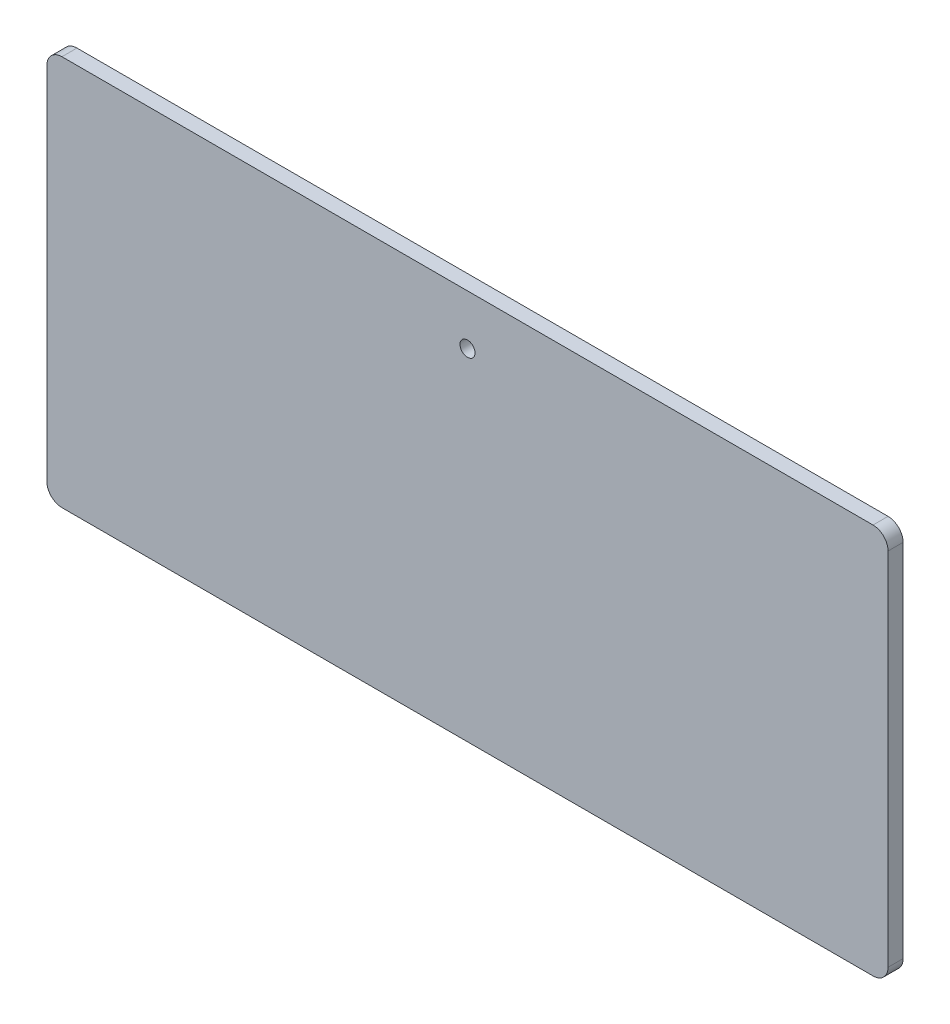
ISO-10303-21;
HEADER;
FILE_DESCRIPTION(('STEP AP214'),'2;1');
FILE_NAME('part.step','',(''),(''),'','','');
FILE_SCHEMA(('AUTOMOTIVE_DESIGN { 1 0 10303 214 1 1 1 1 }'));
ENDSEC;
DATA;
#1=APPLICATION_CONTEXT('core data for automotive mechanical design processes');
#2=APPLICATION_PROTOCOL_DEFINITION('international standard','automotive_design',2000,#1);
#3=PRODUCT_CONTEXT('',#1,'mechanical');
#4=PRODUCT('Part','Part','',(#3));
#5=PRODUCT_RELATED_PRODUCT_CATEGORY('part','',(#4));
#6=PRODUCT_DEFINITION_FORMATION('','',#4);
#7=PRODUCT_DEFINITION_CONTEXT('part definition',#1,'design');
#8=PRODUCT_DEFINITION('design','',#6,#7);
#9=PRODUCT_DEFINITION_SHAPE('','',#8);
#10=(LENGTH_UNIT() NAMED_UNIT(*) SI_UNIT(.MILLI.,.METRE.));
#11=(NAMED_UNIT(*) PLANE_ANGLE_UNIT() SI_UNIT($,.RADIAN.));
#12=(NAMED_UNIT(*) SI_UNIT($,.STERADIAN.) SOLID_ANGLE_UNIT());
#13=UNCERTAINTY_MEASURE_WITH_UNIT(LENGTH_MEASURE(1.E-05),#10,'distance_accuracy_value','');
#14=(GEOMETRIC_REPRESENTATION_CONTEXT(3) GLOBAL_UNCERTAINTY_ASSIGNED_CONTEXT((#13)) GLOBAL_UNIT_ASSIGNED_CONTEXT((#10,
#11,#12)) REPRESENTATION_CONTEXT('',''));
#15=CARTESIAN_POINT('',(0.,0.,0.));
#16=DIRECTION('',(0.,0.,1.));
#17=DIRECTION('',(1.,0.,0.));
#18=AXIS2_PLACEMENT_3D('',#15,#16,#17);
#19=CARTESIAN_POINT('',(0.,0.,3.));
#20=DIRECTION('',(1.,0.,0.));
#21=DIRECTION('',(0.,0.,-1.));
#22=AXIS2_PLACEMENT_3D('',#19,#20,#21);
#23=PLANE('',#22);
#24=DIRECTION('',(0.,-1.,0.));
#25=VECTOR('',#24,1.);
#26=CARTESIAN_POINT('',(0.,0.,3.));
#27=LINE('',#26,#25);
#28=CARTESIAN_POINT('',(0.,75.,3.));
#29=VERTEX_POINT('',#28);
#30=CARTESIAN_POINT('',(0.,3.,3.));
#31=VERTEX_POINT('',#30);
#32=EDGE_CURVE('E118',#29,#31,#27,.T.);
#33=ORIENTED_EDGE('',*,*,#32,.F.);
#34=DIRECTION('',(0.,0.,-1.));
#35=VECTOR('',#34,1.);
#36=CARTESIAN_POINT('',(0.,75.,3.));
#37=LINE('',#36,#35);
#38=CARTESIAN_POINT('',(0.,75.,0.));
#39=VERTEX_POINT('',#38);
#40=EDGE_CURVE('E103',#29,#39,#37,.T.);
#41=ORIENTED_EDGE('',*,*,#40,.T.);
#42=DIRECTION('',(0.,-1.,0.));
#43=VECTOR('',#42,1.);
#44=CARTESIAN_POINT('',(0.,0.,0.));
#45=LINE('',#44,#43);
#46=CARTESIAN_POINT('',(0.,3.,0.));
#47=VERTEX_POINT('',#46);
#48=EDGE_CURVE('E115',#39,#47,#45,.T.);
#49=ORIENTED_EDGE('',*,*,#48,.T.);
#50=DIRECTION('',(0.,0.,-1.));
#51=VECTOR('',#50,1.);
#52=CARTESIAN_POINT('',(0.,3.,3.));
#53=LINE('',#52,#51);
#54=EDGE_CURVE('E120',#47,#31,#53,.F.);
#55=ORIENTED_EDGE('',*,*,#54,.T.);
#56=EDGE_LOOP('',(#33,#41,#49,#55));
#57=FACE_BOUND('',#56,.T.);
#58=ADVANCED_FACE('F33',(#57),#23,.F.);
#59=CARTESIAN_POINT('',(0.,0.,3.));
#60=DIRECTION('',(0.,1.,0.));
#61=DIRECTION('',(0.,0.,1.));
#62=AXIS2_PLACEMENT_3D('',#59,#60,#61);
#63=PLANE('',#62);
#64=DIRECTION('',(1.,0.,0.));
#65=VECTOR('',#64,1.);
#66=CARTESIAN_POINT('',(0.,0.,3.));
#67=LINE('',#66,#65);
#68=CARTESIAN_POINT('',(3.,0.,3.));
#69=VERTEX_POINT('',#68);
#70=CARTESIAN_POINT('',(165.,0.,3.));
#71=VERTEX_POINT('',#70);
#72=EDGE_CURVE('E164',#69,#71,#67,.T.);
#73=ORIENTED_EDGE('',*,*,#72,.F.);
#74=DIRECTION('',(0.,0.,-1.));
#75=VECTOR('',#74,1.);
#76=CARTESIAN_POINT('',(3.,0.,3.));
#77=LINE('',#76,#75);
#78=CARTESIAN_POINT('',(3.,0.,0.));
#79=VERTEX_POINT('',#78);
#80=EDGE_CURVE('E157',#69,#79,#77,.T.);
#81=ORIENTED_EDGE('',*,*,#80,.T.);
#82=DIRECTION('',(1.,0.,0.));
#83=VECTOR('',#82,1.);
#84=CARTESIAN_POINT('',(0.,0.,0.));
#85=LINE('',#84,#83);
#86=CARTESIAN_POINT('',(165.,0.,0.));
#87=VERTEX_POINT('',#86);
#88=EDGE_CURVE('E124',#79,#87,#85,.T.);
#89=ORIENTED_EDGE('',*,*,#88,.T.);
#90=DIRECTION('',(0.,0.,-1.));
#91=VECTOR('',#90,1.);
#92=CARTESIAN_POINT('',(165.,0.,3.));
#93=LINE('',#92,#91);
#94=EDGE_CURVE('E155',#87,#71,#93,.F.);
#95=ORIENTED_EDGE('',*,*,#94,.T.);
#96=EDGE_LOOP('',(#73,#81,#89,#95));
#97=FACE_BOUND('',#96,.T.);
#98=ADVANCED_FACE('F162',(#97),#63,.F.);
#99=CARTESIAN_POINT('',(168.,0.,3.));
#100=DIRECTION('',(-1.,0.,0.));
#101=DIRECTION('',(0.,0.,1.));
#102=AXIS2_PLACEMENT_3D('',#99,#100,#101);
#103=PLANE('',#102);
#104=DIRECTION('',(0.,1.,0.));
#105=VECTOR('',#104,1.);
#106=CARTESIAN_POINT('',(168.,0.,3.));
#107=LINE('',#106,#105);
#108=CARTESIAN_POINT('',(168.,3.,3.));
#109=VERTEX_POINT('',#108);
#110=CARTESIAN_POINT('',(168.,75.,3.));
#111=VERTEX_POINT('',#110);
#112=EDGE_CURVE('E172',#109,#111,#107,.T.);
#113=ORIENTED_EDGE('',*,*,#112,.F.);
#114=DIRECTION('',(0.,0.,-1.));
#115=VECTOR('',#114,1.);
#116=CARTESIAN_POINT('',(168.,3.,3.));
#117=LINE('',#116,#115);
#118=CARTESIAN_POINT('',(168.,3.,0.));
#119=VERTEX_POINT('',#118);
#120=EDGE_CURVE('E11',#109,#119,#117,.T.);
#121=ORIENTED_EDGE('',*,*,#120,.T.);
#122=DIRECTION('',(0.,1.,0.));
#123=VECTOR('',#122,1.);
#124=CARTESIAN_POINT('',(168.,0.,0.));
#125=LINE('',#124,#123);
#126=CARTESIAN_POINT('',(168.,75.,0.));
#127=VERTEX_POINT('',#126);
#128=EDGE_CURVE('E128',#119,#127,#125,.T.);
#129=ORIENTED_EDGE('',*,*,#128,.T.);
#130=DIRECTION('',(0.,0.,-1.));
#131=VECTOR('',#130,1.);
#132=CARTESIAN_POINT('',(168.,75.,3.));
#133=LINE('',#132,#131);
#134=EDGE_CURVE('E41',#127,#111,#133,.F.);
#135=ORIENTED_EDGE('',*,*,#134,.T.);
#136=EDGE_LOOP('',(#113,#121,#129,#135));
#137=FACE_BOUND('',#136,.T.);
#138=ADVANCED_FACE('F171',(#137),#103,.F.);
#139=CARTESIAN_POINT('',(0.,78.,3.));
#140=DIRECTION('',(0.,-1.,0.));
#141=DIRECTION('',(0.,0.,-1.));
#142=AXIS2_PLACEMENT_3D('',#139,#140,#141);
#143=PLANE('',#142);
#144=DIRECTION('',(-1.,0.,0.));
#145=VECTOR('',#144,1.);
#146=CARTESIAN_POINT('',(0.,78.,0.));
#147=LINE('',#146,#145);
#148=CARTESIAN_POINT('',(165.,78.,0.));
#149=VERTEX_POINT('',#148);
#150=CARTESIAN_POINT('',(3.,78.,0.));
#151=VERTEX_POINT('',#150);
#152=EDGE_CURVE('E138',#149,#151,#147,.T.);
#153=ORIENTED_EDGE('',*,*,#152,.T.);
#154=DIRECTION('',(0.,0.,-1.));
#155=VECTOR('',#154,1.);
#156=CARTESIAN_POINT('',(3.,78.,3.));
#157=LINE('',#156,#155);
#158=CARTESIAN_POINT('',(3.,78.,3.));
#159=VERTEX_POINT('',#158);
#160=EDGE_CURVE('E104',#151,#159,#157,.F.);
#161=ORIENTED_EDGE('',*,*,#160,.T.);
#162=DIRECTION('',(-1.,0.,0.));
#163=VECTOR('',#162,1.);
#164=CARTESIAN_POINT('',(0.,78.,3.));
#165=LINE('',#164,#163);
#166=CARTESIAN_POINT('',(165.,78.,3.));
#167=VERTEX_POINT('',#166);
#168=EDGE_CURVE('E134',#167,#159,#165,.T.);
#169=ORIENTED_EDGE('',*,*,#168,.F.);
#170=DIRECTION('',(0.,0.,-1.));
#171=VECTOR('',#170,1.);
#172=CARTESIAN_POINT('',(165.,78.,3.));
#173=LINE('',#172,#171);
#174=EDGE_CURVE('E109',#167,#149,#173,.T.);
#175=ORIENTED_EDGE('',*,*,#174,.T.);
#176=EDGE_LOOP('',(#153,#161,#169,#175));
#177=FACE_BOUND('',#176,.T.);
#178=ADVANCED_FACE('F185',(#177),#143,.F.);
#179=CARTESIAN_POINT('',(0.,0.,3.));
#180=DIRECTION('',(0.,0.,-1.));
#181=DIRECTION('',(-1.,0.,0.));
#182=AXIS2_PLACEMENT_3D('',#179,#180,#181);
#183=PLANE('',#182);
#184=CARTESIAN_POINT('',(84.,68.,3.));
#185=DIRECTION('',(0.,0.,1.));
#186=DIRECTION('',(1.,0.,0.));
#187=AXIS2_PLACEMENT_3D('',#184,#185,#186);
#188=CIRCLE('',#187,1.5);
#189=CARTESIAN_POINT('',(85.5,68.,3.));
#190=VERTEX_POINT('',#189);
#191=EDGE_CURVE('E131',#190,#190,#188,.T.);
#192=ORIENTED_EDGE('',*,*,#191,.F.);
#193=EDGE_LOOP('',(#192));
#194=FACE_BOUND('',#193,.T.);
#195=ORIENTED_EDGE('',*,*,#168,.T.);
#196=CARTESIAN_POINT('',(3.,75.,3.));
#197=DIRECTION('',(0.,0.,-1.));
#198=DIRECTION('',(-1.,0.,0.));
#199=AXIS2_PLACEMENT_3D('',#196,#197,#198);
#200=CIRCLE('',#199,3.);
#201=EDGE_CURVE('E153',#159,#29,#200,.F.);
#202=ORIENTED_EDGE('',*,*,#201,.T.);
#203=ORIENTED_EDGE('',*,*,#32,.T.);
#204=CARTESIAN_POINT('',(3.,3.,3.));
#205=DIRECTION('',(0.,0.,-1.));
#206=DIRECTION('',(-1.,0.,0.));
#207=AXIS2_PLACEMENT_3D('',#204,#205,#206);
#208=CIRCLE('',#207,3.);
#209=EDGE_CURVE('E151',#31,#69,#208,.F.);
#210=ORIENTED_EDGE('',*,*,#209,.T.);
#211=ORIENTED_EDGE('',*,*,#72,.T.);
#212=CARTESIAN_POINT('',(165.,3.,3.));
#213=DIRECTION('',(0.,0.,-1.));
#214=DIRECTION('',(-1.,0.,0.));
#215=AXIS2_PLACEMENT_3D('',#212,#213,#214);
#216=CIRCLE('',#215,3.);
#217=EDGE_CURVE('E54',#71,#109,#216,.F.);
#218=ORIENTED_EDGE('',*,*,#217,.T.);
#219=ORIENTED_EDGE('',*,*,#112,.T.);
#220=CARTESIAN_POINT('',(165.,75.,3.));
#221=DIRECTION('',(0.,0.,-1.));
#222=DIRECTION('',(-1.,0.,0.));
#223=AXIS2_PLACEMENT_3D('',#220,#221,#222);
#224=CIRCLE('',#223,3.);
#225=EDGE_CURVE('E148',#111,#167,#224,.F.);
#226=ORIENTED_EDGE('',*,*,#225,.T.);
#227=EDGE_LOOP('',(#195,#202,#203,#210,#211,#218,#219,#226));
#228=FACE_BOUND('',#227,.T.);
#229=ADVANCED_FACE('F183',(#194,#228),#183,.F.);
#230=CARTESIAN_POINT('',(0.,0.,0.));
#231=DIRECTION('',(0.,0.,-1.));
#232=DIRECTION('',(-1.,0.,0.));
#233=AXIS2_PLACEMENT_3D('',#230,#231,#232);
#234=PLANE('',#233);
#235=CARTESIAN_POINT('',(84.,68.,0.));
#236=DIRECTION('',(0.,0.,1.));
#237=DIRECTION('',(1.,0.,0.));
#238=AXIS2_PLACEMENT_3D('',#235,#236,#237);
#239=CIRCLE('',#238,1.5);
#240=CARTESIAN_POINT('',(85.5,68.,0.));
#241=VERTEX_POINT('',#240);
#242=EDGE_CURVE('E125',#241,#241,#239,.T.);
#243=ORIENTED_EDGE('',*,*,#242,.T.);
#244=EDGE_LOOP('',(#243));
#245=FACE_BOUND('',#244,.T.);
#246=ORIENTED_EDGE('',*,*,#48,.F.);
#247=CARTESIAN_POINT('',(3.,75.,0.));
#248=DIRECTION('',(0.,0.,-1.));
#249=DIRECTION('',(-1.,0.,0.));
#250=AXIS2_PLACEMENT_3D('',#247,#248,#249);
#251=CIRCLE('',#250,3.);
#252=EDGE_CURVE('E99',#39,#151,#251,.T.);
#253=ORIENTED_EDGE('',*,*,#252,.T.);
#254=ORIENTED_EDGE('',*,*,#152,.F.);
#255=CARTESIAN_POINT('',(165.,75.,0.));
#256=DIRECTION('',(0.,0.,-1.));
#257=DIRECTION('',(-1.,0.,0.));
#258=AXIS2_PLACEMENT_3D('',#255,#256,#257);
#259=CIRCLE('',#258,3.);
#260=EDGE_CURVE('E119',#149,#127,#259,.T.);
#261=ORIENTED_EDGE('',*,*,#260,.T.);
#262=ORIENTED_EDGE('',*,*,#128,.F.);
#263=CARTESIAN_POINT('',(165.,3.,0.));
#264=DIRECTION('',(0.,0.,-1.));
#265=DIRECTION('',(-1.,0.,0.));
#266=AXIS2_PLACEMENT_3D('',#263,#264,#265);
#267=CIRCLE('',#266,3.);
#268=EDGE_CURVE('E142',#119,#87,#267,.T.);
#269=ORIENTED_EDGE('',*,*,#268,.T.);
#270=ORIENTED_EDGE('',*,*,#88,.F.);
#271=CARTESIAN_POINT('',(3.,3.,0.));
#272=DIRECTION('',(0.,0.,-1.));
#273=DIRECTION('',(-1.,0.,0.));
#274=AXIS2_PLACEMENT_3D('',#271,#272,#273);
#275=CIRCLE('',#274,3.);
#276=EDGE_CURVE('E110',#79,#47,#275,.T.);
#277=ORIENTED_EDGE('',*,*,#276,.T.);
#278=EDGE_LOOP('',(#246,#253,#254,#261,#262,#269,#270,#277));
#279=FACE_BOUND('',#278,.T.);
#280=ADVANCED_FACE('F122',(#245,#279),#234,.T.);
#281=CARTESIAN_POINT('',(3.,75.,3.));
#282=DIRECTION('',(0.,0.,-1.));
#283=DIRECTION('',(-1.,0.,0.));
#284=AXIS2_PLACEMENT_3D('',#281,#282,#283);
#285=CYLINDRICAL_SURFACE('',#284,3.);
#286=ORIENTED_EDGE('',*,*,#201,.F.);
#287=ORIENTED_EDGE('',*,*,#160,.F.);
#288=ORIENTED_EDGE('',*,*,#252,.F.);
#289=ORIENTED_EDGE('',*,*,#40,.F.);
#290=EDGE_LOOP('',(#286,#287,#288,#289));
#291=FACE_BOUND('',#290,.T.);
#292=ADVANCED_FACE('F102',(#291),#285,.T.);
#293=CARTESIAN_POINT('',(3.,3.,3.));
#294=DIRECTION('',(0.,0.,-1.));
#295=DIRECTION('',(-1.,0.,0.));
#296=AXIS2_PLACEMENT_3D('',#293,#294,#295);
#297=CYLINDRICAL_SURFACE('',#296,3.);
#298=ORIENTED_EDGE('',*,*,#209,.F.);
#299=ORIENTED_EDGE('',*,*,#54,.F.);
#300=ORIENTED_EDGE('',*,*,#276,.F.);
#301=ORIENTED_EDGE('',*,*,#80,.F.);
#302=EDGE_LOOP('',(#298,#299,#300,#301));
#303=FACE_BOUND('',#302,.T.);
#304=ADVANCED_FACE('F198',(#303),#297,.T.);
#305=CARTESIAN_POINT('',(165.,3.,3.));
#306=DIRECTION('',(0.,0.,-1.));
#307=DIRECTION('',(-1.,0.,0.));
#308=AXIS2_PLACEMENT_3D('',#305,#306,#307);
#309=CYLINDRICAL_SURFACE('',#308,3.);
#310=ORIENTED_EDGE('',*,*,#217,.F.);
#311=ORIENTED_EDGE('',*,*,#94,.F.);
#312=ORIENTED_EDGE('',*,*,#268,.F.);
#313=ORIENTED_EDGE('',*,*,#120,.F.);
#314=EDGE_LOOP('',(#310,#311,#312,#313));
#315=FACE_BOUND('',#314,.T.);
#316=ADVANCED_FACE('F170',(#315),#309,.T.);
#317=CARTESIAN_POINT('',(165.,75.,3.));
#318=DIRECTION('',(0.,0.,-1.));
#319=DIRECTION('',(-1.,0.,0.));
#320=AXIS2_PLACEMENT_3D('',#317,#318,#319);
#321=CYLINDRICAL_SURFACE('',#320,3.);
#322=ORIENTED_EDGE('',*,*,#225,.F.);
#323=ORIENTED_EDGE('',*,*,#134,.F.);
#324=ORIENTED_EDGE('',*,*,#260,.F.);
#325=ORIENTED_EDGE('',*,*,#174,.F.);
#326=EDGE_LOOP('',(#322,#323,#324,#325));
#327=FACE_BOUND('',#326,.T.);
#328=ADVANCED_FACE('F35',(#327),#321,.T.);
#329=CARTESIAN_POINT('',(84.,68.,0.));
#330=DIRECTION('',(0.,0.,1.));
#331=DIRECTION('',(1.,0.,0.));
#332=AXIS2_PLACEMENT_3D('',#329,#330,#331);
#333=CYLINDRICAL_SURFACE('',#332,1.5);
#334=ORIENTED_EDGE('',*,*,#242,.F.);
#335=EDGE_LOOP('',(#334));
#336=FACE_BOUND('',#335,.T.);
#337=ORIENTED_EDGE('',*,*,#191,.T.);
#338=EDGE_LOOP('',(#337));
#339=FACE_BOUND('',#338,.T.);
#340=ADVANCED_FACE('F181',(#336,#339),#333,.F.);
#341=CLOSED_SHELL('',(#58,#98,#138,#178,#229,#280,#292,#304,#316,#328,#340));
#342=MANIFOLD_SOLID_BREP('B2',#341);
#343=ADVANCED_BREP_SHAPE_REPRESENTATION('',(#18,#342),#14);
#344=SHAPE_DEFINITION_REPRESENTATION(#9,#343);
ENDSEC;
END-ISO-10303-21;
